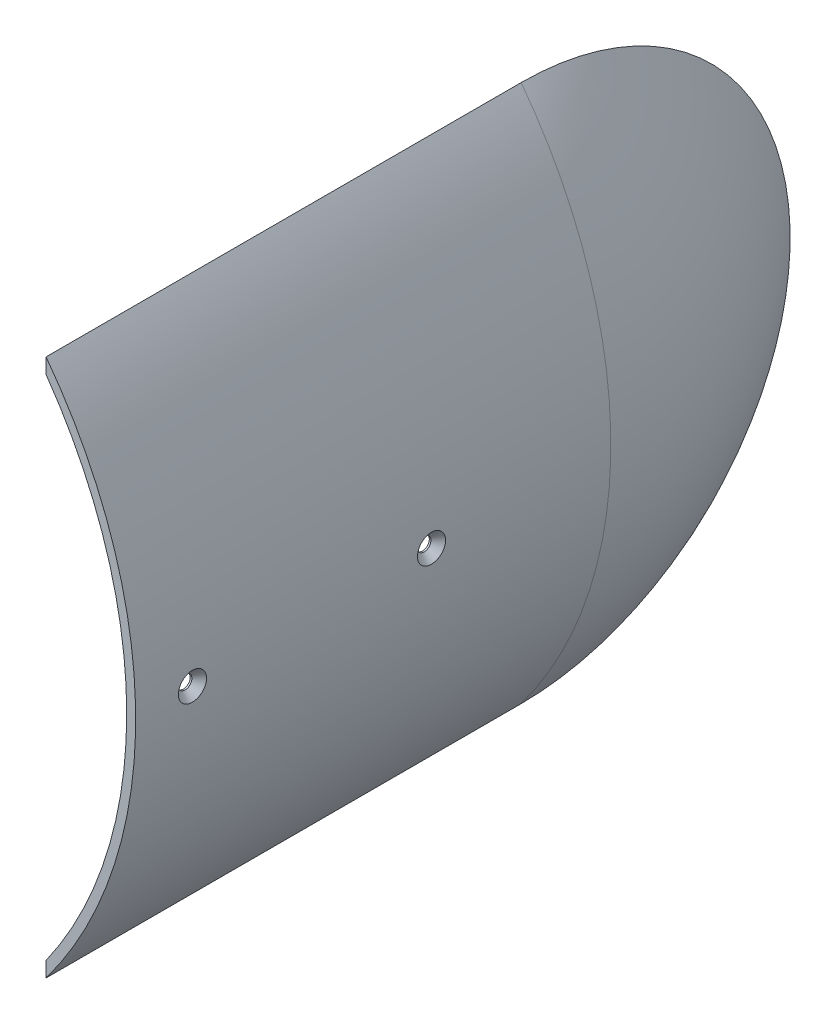
ISO-10303-21;
HEADER;
FILE_DESCRIPTION(('STEP AP214'),'2;1');
FILE_NAME('part.step','',(''),(''),'','','');
FILE_SCHEMA(('AUTOMOTIVE_DESIGN { 1 0 10303 214 1 1 1 1 }'));
ENDSEC;
DATA;
#1=APPLICATION_CONTEXT('core data for automotive mechanical design processes');
#2=APPLICATION_PROTOCOL_DEFINITION('international standard','automotive_design',2000,#1);
#3=PRODUCT_CONTEXT('',#1,'mechanical');
#4=PRODUCT('Part','Part','',(#3));
#5=PRODUCT_RELATED_PRODUCT_CATEGORY('part','',(#4));
#6=PRODUCT_DEFINITION_FORMATION('','',#4);
#7=PRODUCT_DEFINITION_CONTEXT('part definition',#1,'design');
#8=PRODUCT_DEFINITION('design','',#6,#7);
#9=PRODUCT_DEFINITION_SHAPE('','',#8);
#10=(LENGTH_UNIT() NAMED_UNIT(*) SI_UNIT(.MILLI.,.METRE.));
#11=(NAMED_UNIT(*) PLANE_ANGLE_UNIT() SI_UNIT($,.RADIAN.));
#12=(NAMED_UNIT(*) SI_UNIT($,.STERADIAN.) SOLID_ANGLE_UNIT());
#13=UNCERTAINTY_MEASURE_WITH_UNIT(LENGTH_MEASURE(1.E-05),#10,'distance_accuracy_value','');
#14=(GEOMETRIC_REPRESENTATION_CONTEXT(3) GLOBAL_UNCERTAINTY_ASSIGNED_CONTEXT((#13)) GLOBAL_UNIT_ASSIGNED_CONTEXT((#10,
#11,#12)) REPRESENTATION_CONTEXT('',''));
#15=CARTESIAN_POINT('',(0.,0.,0.));
#16=DIRECTION('',(0.,0.,1.));
#17=DIRECTION('',(1.,0.,0.));
#18=AXIS2_PLACEMENT_3D('',#15,#16,#17);
#19=CARTESIAN_POINT('',(0.,0.,0.));
#20=DIRECTION('',(0.,0.,1.));
#21=DIRECTION('',(0.707106781186546,-0.707106781186549,0.));
#22=AXIS2_PLACEMENT_3D('',#19,#20,#21);
#23=SPHERICAL_SURFACE('',#22,150.);
#24=CARTESIAN_POINT('',(0.,0.,0.));
#25=DIRECTION('',(0.,0.,1.));
#26=DIRECTION('',(1.,0.,0.));
#27=AXIS2_PLACEMENT_3D('',#24,#25,#26);
#28=CIRCLE('',#27,150.);
#29=CARTESIAN_POINT('',(120.,-90.,0.));
#30=VERTEX_POINT('',#29);
#31=CARTESIAN_POINT('',(120.,90.,0.));
#32=VERTEX_POINT('',#31);
#33=EDGE_CURVE('E95',#30,#32,#28,.T.);
#34=ORIENTED_EDGE('',*,*,#33,.F.);
#35=CARTESIAN_POINT('',(120.,0.,0.));
#36=DIRECTION('',(-1.,0.,0.));
#37=DIRECTION('',(0.,0.,1.));
#38=AXIS2_PLACEMENT_3D('',#35,#36,#37);
#39=CIRCLE('',#38,89.9999999999997);
#40=EDGE_CURVE('E88',#32,#30,#39,.T.);
#41=ORIENTED_EDGE('',*,*,#40,.F.);
#42=EDGE_LOOP('',(#34,#41));
#43=FACE_BOUND('',#42,.T.);
#44=ADVANCED_FACE('F35',(#43),#23,.T.);
#45=CARTESIAN_POINT('',(0.,0.,0.));
#46=DIRECTION('',(0.,0.,1.));
#47=DIRECTION('',(0.707106781186546,-0.707106781186549,0.));
#48=AXIS2_PLACEMENT_3D('',#45,#46,#47);
#49=SPHERICAL_SURFACE('',#48,147.);
#50=CARTESIAN_POINT('',(0.,0.,0.));
#51=DIRECTION('',(0.,0.,-1.));
#52=DIRECTION('',(1.,0.,0.));
#53=AXIS2_PLACEMENT_3D('',#50,#51,#52);
#54=CIRCLE('',#53,147.);
#55=CARTESIAN_POINT('',(120.,84.9058301885094,0.));
#56=VERTEX_POINT('',#55);
#57=CARTESIAN_POINT('',(120.,-84.9058301885094,0.));
#58=VERTEX_POINT('',#57);
#59=EDGE_CURVE('E91',#56,#58,#54,.T.);
#60=ORIENTED_EDGE('',*,*,#59,.F.);
#61=CARTESIAN_POINT('',(120.,0.,0.));
#62=DIRECTION('',(-1.,0.,0.));
#63=DIRECTION('',(0.,0.,1.));
#64=AXIS2_PLACEMENT_3D('',#61,#62,#63);
#65=CIRCLE('',#64,84.9058301885091);
#66=EDGE_CURVE('E78',#58,#56,#65,.F.);
#67=ORIENTED_EDGE('',*,*,#66,.F.);
#68=EDGE_LOOP('',(#60,#67));
#69=FACE_BOUND('',#68,.T.);
#70=ADVANCED_FACE('F92',(#69),#49,.F.);
#71=CARTESIAN_POINT('',(0.,0.,159.));
#72=DIRECTION('',(0.,0.,-1.));
#73=DIRECTION('',(-1.,0.,0.));
#74=AXIS2_PLACEMENT_3D('',#71,#72,#73);
#75=CYLINDRICAL_SURFACE('',#74,150.);
#76=CARTESIAN_POINT('',(149.963711516846,-3.29927693076681,136.703793568535));
#77=CARTESIAN_POINT('',(149.960177438163,-3.45991808115799,136.869590821439));
#78=CARTESIAN_POINT('',(149.956655071522,-3.60827631750234,137.047369029014));
#79=CARTESIAN_POINT('',(149.949939356816,-3.877351146255,137.4228858195));
#80=CARTESIAN_POINT('',(149.946746278919,-3.99804513897104,137.620640533132));
#81=CARTESIAN_POINT('',(149.940554616057,-4.22430307955091,138.061025128286));
#82=CARTESIAN_POINT('',(149.937648395354,-4.32526869296003,138.306036039697));
#83=CARTESIAN_POINT('',(149.932951101816,-4.48515452730595,138.80944359398));
#84=CARTESIAN_POINT('',(149.931160328584,-4.54406345269391,139.067843812969));
#85=CARTESIAN_POINT('',(149.928879040552,-4.61873035421112,139.593669563639));
#86=CARTESIAN_POINT('',(149.928402750995,-4.63401630568057,139.861162360825));
#87=CARTESIAN_POINT('',(149.928844870639,-4.61968829566137,140.394932697987));
#88=CARTESIAN_POINT('',(149.929763262133,-4.59007490422189,140.661210253349));
#89=CARTESIAN_POINT('',(149.932898361615,-4.48649734256548,141.186149427737));
#90=CARTESIAN_POINT('',(149.935120445897,-4.41234948663331,141.444774823469));
#91=CARTESIAN_POINT('',(149.940615184469,-4.22148976560155,141.945813805521));
#92=CARTESIAN_POINT('',(149.943887837765,-4.10477794080732,142.188227407191));
#93=CARTESIAN_POINT('',(149.951090809016,-3.83258835076391,142.648594497941));
#94=CARTESIAN_POINT('',(149.955017789638,-3.67730543530427,142.866663179351));
#95=CARTESIAN_POINT('',(149.963089300736,-3.3319056046011,143.273213069164));
#96=CARTESIAN_POINT('',(149.967233817459,-3.14179088937551,143.461696144834));
#97=CARTESIAN_POINT('',(149.975207210311,-2.73460927291729,143.801163921327));
#98=CARTESIAN_POINT('',(149.979039373112,-2.51790729878557,143.952586162308));
#99=CARTESIAN_POINT('',(149.986001801176,-2.06183869393164,144.216252362287));
#100=CARTESIAN_POINT('',(149.989132128973,-1.82247408513677,144.328499812223));
#101=CARTESIAN_POINT('',(149.994285616131,-1.33174421104542,144.508889560413));
#102=CARTESIAN_POINT('',(149.996324712351,-1.08061345008694,144.577669533399));
#103=CARTESIAN_POINT('',(149.999132629382,-0.570317904118171,144.671603104254));
#104=CARTESIAN_POINT('',(149.999901540948,-0.311153694452898,144.696759819049));
#105=CARTESIAN_POINT('',(150.000079660846,0.204917307846344,144.702621428006));
#106=CARTESIAN_POINT('',(149.999503198008,0.461818903695111,144.68379476239));
#107=CARTESIAN_POINT('',(149.99708569365,0.968794032111193,144.603251561756));
#108=CARTESIAN_POINT('',(149.995244675656,1.21886769161321,144.541535824631));
#109=CARTESIAN_POINT('',(149.990507214639,1.70494194013315,144.377190307556));
#110=CARTESIAN_POINT('',(149.987611611774,1.94095355830558,144.274593090624));
#111=CARTESIAN_POINT('',(149.981087058968,2.39261515696912,144.031591170132));
#112=CARTESIAN_POINT('',(149.977458081188,2.60826436402132,143.891185031229));
#113=CARTESIAN_POINT('',(149.969830068977,3.01528756294487,143.575237478157));
#114=CARTESIAN_POINT('',(149.965827911192,3.20641754593795,143.399381912095));
#115=CARTESIAN_POINT('',(149.957923582015,3.55696106979604,143.018487797472));
#116=CARTESIAN_POINT('',(149.954021417859,3.71637232046546,142.813447143485));
#117=CARTESIAN_POINT('',(149.946687907184,4.00143518718085,142.376799025538));
#118=CARTESIAN_POINT('',(149.943264275763,4.12655931656105,142.14484706274));
#119=CARTESIAN_POINT('',(149.937334311566,4.33669011735863,141.663422775416));
#120=CARTESIAN_POINT('',(149.934828047256,4.42169379453287,141.413949144819));
#121=CARTESIAN_POINT('',(149.930981484684,4.55027787719948,140.900994183296));
#122=CARTESIAN_POINT('',(149.929657164974,4.59329132918213,140.637370512808));
#123=CARTESIAN_POINT('',(149.928379736923,4.63480194208962,140.106633421594));
#124=CARTESIAN_POINT('',(149.92842669674,4.63329689029003,139.839519828066));
#125=CARTESIAN_POINT('',(149.929891796762,4.58564177830561,139.307465308326));
#126=CARTESIAN_POINT('',(149.931319264771,4.53918800796954,139.042551532788));
#127=CARTESIAN_POINT('',(149.935397996528,4.40239345257302,138.524308564669));
#128=CARTESIAN_POINT('',(149.938049265825,4.31205246848905,138.270979424627));
#129=CARTESIAN_POINT('',(149.944267315921,4.09010212945715,137.783744975357));
#130=CARTESIAN_POINT('',(149.947832138364,3.95858091916824,137.549799516179));
#131=CARTESIAN_POINT('',(149.955471736463,3.657738732962,137.107622646792));
#132=CARTESIAN_POINT('',(149.959546488807,3.48841948472222,136.89939006197));
#133=CARTESIAN_POINT('',(149.96768999543,3.1186086309176,136.516953838442));
#134=CARTESIAN_POINT('',(149.971758365606,2.91846205894055,136.342416659504));
#135=CARTESIAN_POINT('',(149.979461400611,2.49132174594433,136.0300312887));
#136=CARTESIAN_POINT('',(149.983096101685,2.26433025177052,135.89218002946));
#137=CARTESIAN_POINT('',(149.989458338531,1.79357522922562,135.659258248985));
#138=CARTESIAN_POINT('',(149.992198602759,1.55011254771572,135.563579997045));
#139=CARTESIAN_POINT('',(149.996529589908,1.05045611605368,135.415042075834));
#140=CARTESIAN_POINT('',(149.998120435194,0.794263724196964,135.362177848556));
#141=CARTESIAN_POINT('',(149.999956407376,0.279934455083996,135.301336867916));
#142=CARTESIAN_POINT('',(150.000218495631,0.0218644210149906,135.292794322599));
#143=CARTESIAN_POINT('',(149.999413036307,-0.492056616866934,135.31934158416));
#144=CARTESIAN_POINT('',(149.998345333245,-0.747907357672488,135.354436493234));
#145=CARTESIAN_POINT('',(149.995008199455,-1.24904948969632,135.466933177066));
#146=CARTESIAN_POINT('',(149.992743446554,-1.49437799279328,135.544170306216));
#147=CARTESIAN_POINT('',(149.987269203814,-1.96857022455994,135.738454683283));
#148=CARTESIAN_POINT('',(149.984060395261,-2.1974456790359,135.855473231971));
#149=CARTESIAN_POINT('',(149.97796175815,-2.57626675491984,136.090741746998));
#150=CARTESIAN_POINT('',(149.975203582933,-2.73133087701698,136.200868238295));
#151=CARTESIAN_POINT('',(149.969531441158,-3.02678785649367,136.439230856734));
#152=CARTESIAN_POINT('',(149.966617519485,-3.16718490659124,136.567461783774));
#153=CARTESIAN_POINT('',(149.963711516846,-3.29927693076681,136.703793568535));
#154=B_SPLINE_CURVE_WITH_KNOTS('',3,(#76,#77,#78,#79,#80,#81,#82,#83,#84,#85,#86,#87,#88,#89,
#90,#91,#92,#93,#94,#95,#96,#97,#98,#99,#100,#101,#102,#103,#104,#105,#106,#107,#108,#109,#110,
#111,#112,#113,#114,#115,#116,#117,#118,#119,#120,#121,#122,#123,#124,#125,#126,#127,#128,#129,
#130,#131,#132,#133,#134,#135,#136,#137,#138,#139,#140,#141,#142,#143,#144,#145,#146,#147,#148,
#149,#150,#151,#152,#153),.UNSPECIFIED.,.T.,.F.,(4,2,2,2,2,2,2,2,2,2,2,2,2,2,2,2,2,2,2,2,2,2,2,
2,2,2,2,2,2,2,2,2,2,2,2,2,2,2,4),(0.,0.692112176585254,1.38478775960135,2.17605013552575,
2.96752494814662,3.76753206797697,4.56752903087514,5.37084852055953,6.17416724955362,
6.9735075657107,7.7727974119755,8.56213851807299,9.35140926654721,10.1288147351755,
10.9061646551057,11.6752732935588,12.4443676241551,13.212850574459,13.9813627028263,
14.7570110675012,15.5327154162032,16.3197574844227,17.1068582813628,17.9044453143297,
18.7020719902125,19.5051259895012,20.3081836305827,21.1095339755052,21.9108476997012,
22.7037694055214,23.4966247929041,24.2776481396271,25.0585883272083,25.8295343896975,
26.6005706015013,27.3686157969523,28.136108078663,28.7053813411136,29.274491423674),.UNSPECIFIED.);
#155=CARTESIAN_POINT('',(149.963711516846,-3.29927693076681,136.703793568535));
#156=VERTEX_POINT('',#155);
#157=EDGE_CURVE('E11',#156,#156,#154,.T.);
#158=ORIENTED_EDGE('',*,*,#157,.T.);
#159=EDGE_LOOP('',(#158));
#160=FACE_BOUND('',#159,.T.);
#161=CARTESIAN_POINT('',(149.963711516846,-3.29927693076683,56.7037935685348));
#162=CARTESIAN_POINT('',(149.960177438163,-3.45991808115801,56.8695908214393));
#163=CARTESIAN_POINT('',(149.956655071522,-3.60827631750236,57.0473690290139));
#164=CARTESIAN_POINT('',(149.949939356816,-3.87735114625501,57.4228858194998));
#165=CARTESIAN_POINT('',(149.946746278919,-3.99804513897103,57.6206405331323));
#166=CARTESIAN_POINT('',(149.940554616057,-4.2243030795509,58.0610251282861));
#167=CARTESIAN_POINT('',(149.937648395354,-4.32526869296003,58.3060360396969));
#168=CARTESIAN_POINT('',(149.932951101816,-4.48515452730596,58.8094435939802));
#169=CARTESIAN_POINT('',(149.931160328584,-4.54406345269392,59.0678438129694));
#170=CARTESIAN_POINT('',(149.928879040552,-4.61873035421112,59.5936695636391));
#171=CARTESIAN_POINT('',(149.928402750995,-4.63401630568057,59.8611623608253));
#172=CARTESIAN_POINT('',(149.928844870639,-4.61968829566136,60.3949326979873));
#173=CARTESIAN_POINT('',(149.929763262133,-4.59007490422188,60.661210253349));
#174=CARTESIAN_POINT('',(149.932898361615,-4.48649734256547,61.186149427737));
#175=CARTESIAN_POINT('',(149.935120445897,-4.41234948663329,61.4447748234693));
#176=CARTESIAN_POINT('',(149.940615184469,-4.22148976560153,61.9458138055209));
#177=CARTESIAN_POINT('',(149.943887837765,-4.10477794080731,62.1882274071913));
#178=CARTESIAN_POINT('',(149.951090809016,-3.83258835076389,62.6485944979411));
#179=CARTESIAN_POINT('',(149.955017789638,-3.67730543530425,62.8666631793513));
#180=CARTESIAN_POINT('',(149.963089300736,-3.33190560460108,63.2732130691644));
#181=CARTESIAN_POINT('',(149.967233817459,-3.1417908893755,63.4616961448342));
#182=CARTESIAN_POINT('',(149.975207210311,-2.73460927291728,63.8011639213267));
#183=CARTESIAN_POINT('',(149.979039373112,-2.51790729878556,63.9525861623078));
#184=CARTESIAN_POINT('',(149.986001801176,-2.06183869393162,64.2162523622869));
#185=CARTESIAN_POINT('',(149.989132128973,-1.82247408513675,64.3284998122233));
#186=CARTESIAN_POINT('',(149.994285616131,-1.33174421104541,64.5088895604126));
#187=CARTESIAN_POINT('',(149.996324712351,-1.08061345008693,64.5776695333987));
#188=CARTESIAN_POINT('',(149.999132629382,-0.570317904118162,64.671603104254));
#189=CARTESIAN_POINT('',(149.999901540948,-0.311153694452892,64.6967598190492));
#190=CARTESIAN_POINT('',(150.000079660846,0.204917307846351,64.7026214280056));
#191=CARTESIAN_POINT('',(149.999503198008,0.461818903695121,64.6837947623901));
#192=CARTESIAN_POINT('',(149.99708569365,0.968794032111205,64.6032515617561));
#193=CARTESIAN_POINT('',(149.995244675656,1.21886769161322,64.5415358246314));
#194=CARTESIAN_POINT('',(149.990507214639,1.70494194013317,64.3771903075558));
#195=CARTESIAN_POINT('',(149.987611611774,1.9409535583056,64.2745930906244));
#196=CARTESIAN_POINT('',(149.981087058968,2.39261515696914,64.031591170132));
#197=CARTESIAN_POINT('',(149.977458081188,2.60826436402133,63.8911850312294));
#198=CARTESIAN_POINT('',(149.969830068977,3.01528756294489,63.5752374781567));
#199=CARTESIAN_POINT('',(149.965827911192,3.20641754593797,63.3993819120951));
#200=CARTESIAN_POINT('',(149.957923582015,3.55696106979606,63.0184877974723));
#201=CARTESIAN_POINT('',(149.954021417859,3.71637232046547,62.8134471434852));
#202=CARTESIAN_POINT('',(149.946687907184,4.00143518718086,62.3767990255382));
#203=CARTESIAN_POINT('',(149.943264275763,4.12655931656106,62.1448470627404));
#204=CARTESIAN_POINT('',(149.937334311566,4.33669011735863,61.6634227754155));
#205=CARTESIAN_POINT('',(149.934828047256,4.42169379453287,61.4139491448185));
#206=CARTESIAN_POINT('',(149.930981484684,4.55027787719949,60.9009941832958));
#207=CARTESIAN_POINT('',(149.929657164974,4.59329132918213,60.6373705128082));
#208=CARTESIAN_POINT('',(149.928379736923,4.63480194208962,60.106633421594));
#209=CARTESIAN_POINT('',(149.92842669674,4.63329689029003,59.8395198280657));
#210=CARTESIAN_POINT('',(149.929891796762,4.58564177830561,59.3074653083263));
#211=CARTESIAN_POINT('',(149.931319264771,4.53918800796954,59.0425515327883));
#212=CARTESIAN_POINT('',(149.935397996528,4.40239345257302,58.5243085646685));
#213=CARTESIAN_POINT('',(149.938049265825,4.31205246848905,58.2709794246274));
#214=CARTESIAN_POINT('',(149.944267315921,4.09010212945716,57.7837449753568));
#215=CARTESIAN_POINT('',(149.947832138364,3.95858091916824,57.5497995161794));
#216=CARTESIAN_POINT('',(149.955471736463,3.65773873296201,57.1076226467918));
#217=CARTESIAN_POINT('',(149.959546488807,3.48841948472222,56.8993900619696));
#218=CARTESIAN_POINT('',(149.96768999543,3.11860863091759,56.5169538384423));
#219=CARTESIAN_POINT('',(149.971758365606,2.91846205894054,56.3424166595038));
#220=CARTESIAN_POINT('',(149.979461400611,2.49132174594431,56.0300312887));
#221=CARTESIAN_POINT('',(149.983096101685,2.26433025177049,55.8921800294599));
#222=CARTESIAN_POINT('',(149.989458338531,1.79357522922559,55.659258248985));
#223=CARTESIAN_POINT('',(149.992198602759,1.5501125477157,55.5635799970454));
#224=CARTESIAN_POINT('',(149.996529589908,1.05045611605367,55.4150420758341));
#225=CARTESIAN_POINT('',(149.998120435194,0.794263724196956,55.3621778485559));
#226=CARTESIAN_POINT('',(149.999956407376,0.279934455083991,55.3013368679156));
#227=CARTESIAN_POINT('',(150.000218495631,0.0218644210149852,55.2927943225986));
#228=CARTESIAN_POINT('',(149.999413036307,-0.492056616866944,55.3193415841604));
#229=CARTESIAN_POINT('',(149.998345333245,-0.747907357672502,55.3544364932337));
#230=CARTESIAN_POINT('',(149.995008199455,-1.24904948969632,55.4669331770657));
#231=CARTESIAN_POINT('',(149.992743446554,-1.49437799279328,55.5441703062159));
#232=CARTESIAN_POINT('',(149.987269203814,-1.96857022455994,55.738454683283));
#233=CARTESIAN_POINT('',(149.984060395261,-2.19744567903591,55.8554732319706));
#234=CARTESIAN_POINT('',(149.97796175815,-2.57626675491986,56.0907417469981));
#235=CARTESIAN_POINT('',(149.975203582933,-2.73133087701699,56.2008682382952));
#236=CARTESIAN_POINT('',(149.969531441158,-3.02678785649368,56.4392308567344));
#237=CARTESIAN_POINT('',(149.966617519485,-3.16718490659125,56.5674617837736));
#238=CARTESIAN_POINT('',(149.963711516846,-3.29927693076683,56.7037935685348));
#239=B_SPLINE_CURVE_WITH_KNOTS('',3,(#161,#162,#163,#164,#165,#166,#167,#168,#169,#170,#171,
#172,#173,#174,#175,#176,#177,#178,#179,#180,#181,#182,#183,#184,#185,#186,#187,#188,#189,#190,
#191,#192,#193,#194,#195,#196,#197,#198,#199,#200,#201,#202,#203,#204,#205,#206,#207,#208,#209,
#210,#211,#212,#213,#214,#215,#216,#217,#218,#219,#220,#221,#222,#223,#224,#225,#226,#227,#228,
#229,#230,#231,#232,#233,#234,#235,#236,#237,#238),.UNSPECIFIED.,.T.,.F.,(4,2,2,2,2,2,2,2,2,2,2,
2,2,2,2,2,2,2,2,2,2,2,2,2,2,2,2,2,2,2,2,2,2,2,2,2,2,2,4),(0.,0.692112176585285,1.38478775960135,
2.17605013552575,2.96752494814661,3.76753206797697,4.56752903087516,5.37084852055959,
6.17416724955361,6.97350756571073,7.77279741197548,8.56213851807298,9.35140926654721,
10.1288147351755,10.9061646551057,11.6752732935588,12.444367624155,13.212850574459,
13.9813627028263,14.7570110675012,15.5327154162032,16.3197574844227,17.1068582813627,
17.9044453143297,18.7020719902125,19.5051259895013,20.3081836305827,21.1095339755052,
21.9108476997012,22.7037694055214,23.4966247929041,24.2776481396271,25.0585883272083,
25.8295343896975,26.6005706015013,27.3686157969523,28.136108078663,28.7053813411136,
29.274491423674),.UNSPECIFIED.);
#240=CARTESIAN_POINT('',(149.963711516846,-3.29927693076683,56.7037935685348));
#241=VERTEX_POINT('',#240);
#242=EDGE_CURVE('E49',#241,#241,#239,.T.);
#243=ORIENTED_EDGE('',*,*,#242,.T.);
#244=EDGE_LOOP('',(#243));
#245=FACE_BOUND('',#244,.T.);
#246=ORIENTED_EDGE('',*,*,#33,.T.);
#247=DIRECTION('',(0.,0.,-1.));
#248=VECTOR('',#247,1.);
#249=CARTESIAN_POINT('',(120.,90.,159.));
#250=LINE('',#249,#248);
#251=CARTESIAN_POINT('',(120.,90.,159.));
#252=VERTEX_POINT('',#251);
#253=EDGE_CURVE('E99',#252,#32,#250,.T.);
#254=ORIENTED_EDGE('',*,*,#253,.F.);
#255=CARTESIAN_POINT('',(0.,0.,159.));
#256=DIRECTION('',(0.,0.,1.));
#257=DIRECTION('',(1.,0.,0.));
#258=AXIS2_PLACEMENT_3D('',#255,#256,#257);
#259=CIRCLE('',#258,150.);
#260=CARTESIAN_POINT('',(120.,-90.,159.));
#261=VERTEX_POINT('',#260);
#262=EDGE_CURVE('E94',#261,#252,#259,.T.);
#263=ORIENTED_EDGE('',*,*,#262,.F.);
#264=DIRECTION('',(0.,0.,-1.));
#265=VECTOR('',#264,1.);
#266=CARTESIAN_POINT('',(120.,-90.,159.));
#267=LINE('',#266,#265);
#268=EDGE_CURVE('E103',#261,#30,#267,.T.);
#269=ORIENTED_EDGE('',*,*,#268,.T.);
#270=EDGE_LOOP('',(#246,#254,#263,#269));
#271=FACE_BOUND('',#270,.T.);
#272=ADVANCED_FACE('F37',(#160,#245,#271),#75,.T.);
#273=CARTESIAN_POINT('',(0.,0.,159.));
#274=DIRECTION('',(0.,0.,-1.));
#275=DIRECTION('',(-1.,0.,0.));
#276=AXIS2_PLACEMENT_3D('',#273,#274,#275);
#277=CYLINDRICAL_SURFACE('',#276,147.);
#278=CARTESIAN_POINT('',(147.,0.,137.75));
#279=CARTESIAN_POINT('',(146.999999767354,0.126375546336478,137.750005601714));
#280=CARTESIAN_POINT('',(146.999835283425,0.252842538450478,137.760682915088));
#281=CARTESIAN_POINT('',(146.999194936766,0.502293011050223,137.803128364135));
#282=CARTESIAN_POINT('',(146.998718699995,0.625272121618184,137.834921835643));
#283=CARTESIAN_POINT('',(146.99750879289,0.864096856697377,137.918693813278));
#284=CARTESIAN_POINT('',(146.996775246309,0.979945878971692,137.97066261743));
#285=CARTESIAN_POINT('',(146.995133515181,1.2012425051153,138.093296575769));
#286=CARTESIAN_POINT('',(146.994225373868,1.30669267422046,138.16395710308));
#287=CARTESIAN_POINT('',(146.992336519766,1.50425484706294,138.321989107806));
#288=CARTESIAN_POINT('',(146.991355794104,1.59636447588824,138.409363554261));
#289=CARTESIAN_POINT('',(146.989432422928,1.76461147082046,138.598339554438));
#290=CARTESIAN_POINT('',(146.988489778917,1.84074820738624,138.699941668653));
#291=CARTESIAN_POINT('',(146.986748863578,1.97488608970135,138.914490283503));
#292=CARTESIAN_POINT('',(146.985950596644,2.03288668333953,139.027437129362));
#293=CARTESIAN_POINT('',(146.984588490318,2.12910189655437,139.261466420746));
#294=CARTESIAN_POINT('',(146.984024650333,2.16731656620582,139.382548845681));
#295=CARTESIAN_POINT('',(146.983195019518,2.22287244756071,139.629402358206));
#296=CARTESIAN_POINT('',(146.982929205584,2.24021527739016,139.75517308155));
#297=CARTESIAN_POINT('',(146.98272552697,2.25354013272604,140.007841024247));
#298=CARTESIAN_POINT('',(146.982787661513,2.24952220889604,140.134738240928));
#299=CARTESIAN_POINT('',(146.983232851443,2.22024107086215,140.386045997538));
#300=CARTESIAN_POINT('',(146.983615880035,2.19497963046587,140.510456744196));
#301=CARTESIAN_POINT('',(146.984659633968,2.12393126762693,140.753271333492));
#302=CARTESIAN_POINT('',(146.985320359684,2.07814431738515,140.871675167993));
#303=CARTESIAN_POINT('',(146.986845049273,1.96734264559995,141.099120415609));
#304=CARTESIAN_POINT('',(146.987709021738,1.90232711104284,141.208161432598));
#305=CARTESIAN_POINT('',(146.989542791927,1.75491448625564,141.413781339277));
#306=CARTESIAN_POINT('',(146.990512589681,1.67251739088644,141.510360225282));
#307=CARTESIAN_POINT('',(146.992448796423,1.49267054236976,141.688324715023));
#308=CARTESIAN_POINT('',(146.993415205052,1.39521924405076,141.769708757255));
#309=CARTESIAN_POINT('',(146.99523558526,1.18803577624891,141.914961309399));
#310=CARTESIAN_POINT('',(146.996089556824,1.07830360507403,141.978829816897));
#311=CARTESIAN_POINT('',(146.997588790356,0.849672508553723,142.087238075463));
#312=CARTESIAN_POINT('',(146.998234051826,0.730773561282259,142.131777780296));
#313=CARTESIAN_POINT('',(146.999243111226,0.48718446863825,142.200263105632));
#314=CARTESIAN_POINT('',(146.999606909364,0.362494327561225,142.22420874141));
#315=CARTESIAN_POINT('',(147.000012002912,0.110875969129586,142.250824282197));
#316=CARTESIAN_POINT('',(147.000053331046,-0.016052019813434,142.253496346092));
#317=CARTESIAN_POINT('',(146.999808911958,-0.268554892827875,142.237494513983));
#318=CARTESIAN_POINT('',(146.999523164824,-0.39412977726195,142.218820623701));
#319=CARTESIAN_POINT('',(146.998656829004,-0.640355754904068,142.160658761315));
#320=CARTESIAN_POINT('',(146.998076254163,-0.761007079016152,142.121171766511));
#321=CARTESIAN_POINT('',(146.996685709649,-0.993968090371464,142.022505604477));
#322=CARTESIAN_POINT('',(146.995875739878,-1.10627777404344,141.963326428816));
#323=CARTESIAN_POINT('',(146.99411762266,-1.31937733291162,141.826950250031));
#324=CARTESIAN_POINT('',(146.993169464067,-1.42016627776241,141.749751793307));
#325=CARTESIAN_POINT('',(146.991241893372,-1.60735396686146,141.579530587086));
#326=CARTESIAN_POINT('',(146.990262481239,-1.69375269724934,141.486507822347));
#327=CARTESIAN_POINT('',(146.988382729563,-1.8497145347671,141.287269381347));
#328=CARTESIAN_POINT('',(146.987482396576,-1.91927624660837,141.181052612798));
#329=CARTESIAN_POINT('',(146.985862413186,-2.0395798229459,140.958447006401));
#330=CARTESIAN_POINT('',(146.985142762536,-2.09032171319308,140.842058182472));
#331=CARTESIAN_POINT('',(146.983965325916,-2.17154286454912,140.602417612071));
#332=CARTESIAN_POINT('',(146.98350752817,-2.20202303686456,140.479166174494));
#333=CARTESIAN_POINT('',(146.982905377454,-2.24185853501688,140.229294533727));
#334=CARTESIAN_POINT('',(146.98276102483,-2.25121383751249,140.102674326815));
#335=CARTESIAN_POINT('',(146.98280204456,-2.24853385502184,139.849673771852));
#336=CARTESIAN_POINT('',(146.98298738262,-2.23650079489415,139.723293400221));
#337=CARTESIAN_POINT('',(146.983666817301,-2.19139018442243,139.474346658552));
#338=CARTESIAN_POINT('',(146.984160914541,-2.1583125918957,139.351780296159));
#339=CARTESIAN_POINT('',(146.985402167584,-2.0720516127226,139.113938537857));
#340=CARTESIAN_POINT('',(146.986149328031,-2.01886785702097,138.998663275825));
#341=CARTESIAN_POINT('',(146.987812436142,-1.89390669625394,138.778681713768));
#342=CARTESIAN_POINT('',(146.988728377314,-1.82213000623577,138.673975007513));
#343=CARTESIAN_POINT('',(146.990625823505,-1.66202034493844,138.478096564593));
#344=CARTESIAN_POINT('',(146.991607328366,-1.57368741347504,138.386924795378));
#345=CARTESIAN_POINT('',(146.993525518857,-1.38294323497786,138.220681476247));
#346=CARTESIAN_POINT('',(146.994462193299,-1.28052849769488,138.145613929692));
#347=CARTESIAN_POINT('',(146.996185312889,-1.06450431394408,138.013706296591));
#348=CARTESIAN_POINT('',(146.996971679407,-0.950889054943608,137.956875739951));
#349=CARTESIAN_POINT('',(146.998303944493,-0.715817568199668,137.863161449577));
#350=CARTESIAN_POINT('',(146.998850130797,-0.59437092360367,137.826253836149));
#351=CARTESIAN_POINT('',(146.999493890634,-0.393460046586398,137.783255281058));
#352=CARTESIAN_POINT('',(146.999682862527,-0.315300932251653,137.770800147575));
#353=CARTESIAN_POINT('',(146.999935989987,-0.158106478306908,137.754170754907));
#354=CARTESIAN_POINT('',(147.000000145563,-0.0790711387629302,137.749996495098));
#355=CARTESIAN_POINT('',(147.,0.,137.75));
#356=B_SPLINE_CURVE_WITH_KNOTS('',3,(#278,#279,#280,#281,#282,#283,#284,#285,#286,#287,#288,
#289,#290,#291,#292,#293,#294,#295,#296,#297,#298,#299,#300,#301,#302,#303,#304,#305,#306,#307,
#308,#309,#310,#311,#312,#313,#314,#315,#316,#317,#318,#319,#320,#321,#322,#323,#324,#325,#326,
#327,#328,#329,#330,#331,#332,#333,#334,#335,#336,#337,#338,#339,#340,#341,#342,#343,#344,#345,
#346,#347,#348,#349,#350,#351,#352,#353,#354,#355),.UNSPECIFIED.,.T.,.F.,(4,2,2,2,2,2,2,2,2,2,2,
2,2,2,2,2,2,2,2,2,2,2,2,2,2,2,2,2,2,2,2,2,2,2,2,2,2,2,4),(0.,0.378838026850223,
0.758131418688121,1.13724264025983,1.51626010579022,1.89534496211787,2.27444475654786,
2.65355609063384,3.03266646524916,3.4117474467739,3.79082752919264,4.16987596203145,
4.54892490824334,4.92798988351105,5.30705497085494,5.68615899152725,6.06526306443228,
6.444368044146,6.82347274266947,7.20253896838657,7.58160509250494,7.96065341878597,
8.33970190734545,8.71878098398332,9.097860425741,9.47697127117454,9.85608159787359,
10.2351748741331,10.6142685692597,10.99332283264,11.3723778558181,11.7514398370143,
12.130487242405,12.5095337362439,12.8886743486624,13.2680127630876,13.6468954861734,
13.8839283403544,14.1209611766754),.UNSPECIFIED.);
#357=CARTESIAN_POINT('',(147.,0.,137.75));
#358=VERTEX_POINT('',#357);
#359=EDGE_CURVE('E40',#358,#358,#356,.T.);
#360=ORIENTED_EDGE('',*,*,#359,.T.);
#361=EDGE_LOOP('',(#360));
#362=FACE_BOUND('',#361,.T.);
#363=CARTESIAN_POINT('',(147.,0.,57.75));
#364=CARTESIAN_POINT('',(146.999999767354,0.126375546336478,57.7500056017139));
#365=CARTESIAN_POINT('',(146.999835283425,0.252842538450478,57.7606829150878));
#366=CARTESIAN_POINT('',(146.999194936766,0.502293011050224,57.8031283641349));
#367=CARTESIAN_POINT('',(146.998718699995,0.625272121618186,57.8349218356434));
#368=CARTESIAN_POINT('',(146.99750879289,0.864096856697386,57.9186938132784));
#369=CARTESIAN_POINT('',(146.996775246309,0.979945878971707,57.9706626174305));
#370=CARTESIAN_POINT('',(146.995133515181,1.20124250511532,58.0932965757694));
#371=CARTESIAN_POINT('',(146.994225373868,1.30669267422047,58.1639571030799));
#372=CARTESIAN_POINT('',(146.992336519766,1.50425484706295,58.3219891078064));
#373=CARTESIAN_POINT('',(146.991355794104,1.59636447588825,58.4093635542611));
#374=CARTESIAN_POINT('',(146.989432422928,1.76461147082047,58.5983395544376));
#375=CARTESIAN_POINT('',(146.988489778917,1.84074820738624,58.6999416686527));
#376=CARTESIAN_POINT('',(146.986748863578,1.97488608970135,58.9144902835025));
#377=CARTESIAN_POINT('',(146.985950596644,2.03288668333954,59.0274371293619));
#378=CARTESIAN_POINT('',(146.984588490318,2.12910189655438,59.2614664207462));
#379=CARTESIAN_POINT('',(146.984024650333,2.16731656620582,59.3825488456805));
#380=CARTESIAN_POINT('',(146.983195019518,2.22287244756072,59.6294023582063));
#381=CARTESIAN_POINT('',(146.982929205584,2.24021527739016,59.7551730815498));
#382=CARTESIAN_POINT('',(146.98272552697,2.25354013272604,60.0078410242467));
#383=CARTESIAN_POINT('',(146.982787661513,2.24952220889604,60.1347382409277));
#384=CARTESIAN_POINT('',(146.983232851443,2.22024107086215,60.3860459975376));
#385=CARTESIAN_POINT('',(146.983615880035,2.19497963046586,60.5104567441958));
#386=CARTESIAN_POINT('',(146.984659633968,2.12393126762692,60.7532713334915));
#387=CARTESIAN_POINT('',(146.985320359684,2.07814431738514,60.8716751679931));
#388=CARTESIAN_POINT('',(146.986845049273,1.96734264559994,61.0991204156094));
#389=CARTESIAN_POINT('',(146.987709021738,1.90232711104284,61.2081614325983));
#390=CARTESIAN_POINT('',(146.989542791927,1.75491448625564,61.4137813392771));
#391=CARTESIAN_POINT('',(146.990512589681,1.67251739088643,61.5103602252823));
#392=CARTESIAN_POINT('',(146.992448796423,1.49267054236975,61.6883247150228));
#393=CARTESIAN_POINT('',(146.993415205052,1.39521924405075,61.7697087572551));
#394=CARTESIAN_POINT('',(146.99523558526,1.1880357762489,61.9149613093989));
#395=CARTESIAN_POINT('',(146.996089556824,1.07830360507401,61.9788298168971));
#396=CARTESIAN_POINT('',(146.997588790356,0.849672508553709,62.0872380754628));
#397=CARTESIAN_POINT('',(146.998234051826,0.730773561282245,62.131777780296));
#398=CARTESIAN_POINT('',(146.999243111226,0.487184468638238,62.200263105632));
#399=CARTESIAN_POINT('',(146.999606909364,0.362494327561215,62.2242087414099));
#400=CARTESIAN_POINT('',(147.000012002912,0.110875969129577,62.2508242821972));
#401=CARTESIAN_POINT('',(147.000053331046,-0.0160520198134436,62.2534963460919));
#402=CARTESIAN_POINT('',(146.999808911958,-0.268554892827884,62.237494513983));
#403=CARTESIAN_POINT('',(146.999523164824,-0.394129777261959,62.2188206237006));
#404=CARTESIAN_POINT('',(146.998656829004,-0.640355754904078,62.1606587613145));
#405=CARTESIAN_POINT('',(146.998076254163,-0.761007079016163,62.1211717665107));
#406=CARTESIAN_POINT('',(146.996685709649,-0.993968090371473,62.0225056044766));
#407=CARTESIAN_POINT('',(146.995875739878,-1.10627777404345,61.9633264288158));
#408=CARTESIAN_POINT('',(146.99411762266,-1.31937733291163,61.8269502500306));
#409=CARTESIAN_POINT('',(146.993169464067,-1.42016627776241,61.7497517933068));
#410=CARTESIAN_POINT('',(146.991241893372,-1.60735396686146,61.5795305870858));
#411=CARTESIAN_POINT('',(146.990262481239,-1.69375269724934,61.4865078223469));
#412=CARTESIAN_POINT('',(146.988382729563,-1.84971453476711,61.2872693813471));
#413=CARTESIAN_POINT('',(146.987482396576,-1.91927624660838,61.181052612798));
#414=CARTESIAN_POINT('',(146.985862413186,-2.03957982294591,60.9584470064011));
#415=CARTESIAN_POINT('',(146.985142762536,-2.09032171319308,60.8420581824717));
#416=CARTESIAN_POINT('',(146.983965325916,-2.17154286454912,60.6024176120708));
#417=CARTESIAN_POINT('',(146.98350752817,-2.20202303686455,60.4791661744937));
#418=CARTESIAN_POINT('',(146.982905377454,-2.24185853501688,60.2292945337269));
#419=CARTESIAN_POINT('',(146.98276102483,-2.25121383751249,60.1026743268151));
#420=CARTESIAN_POINT('',(146.98280204456,-2.24853385502184,59.8496737718516));
#421=CARTESIAN_POINT('',(146.98298738262,-2.23650079489414,59.7232934002208));
#422=CARTESIAN_POINT('',(146.983666817301,-2.19139018442242,59.4743466585515));
#423=CARTESIAN_POINT('',(146.984160914541,-2.15831259189569,59.3517802961586));
#424=CARTESIAN_POINT('',(146.985402167584,-2.0720516127226,59.1139385378574));
#425=CARTESIAN_POINT('',(146.986149328031,-2.01886785702097,58.998663275825));
#426=CARTESIAN_POINT('',(146.987812436142,-1.89390669625394,58.778681713768));
#427=CARTESIAN_POINT('',(146.988728377314,-1.82213000623577,58.673975007513));
#428=CARTESIAN_POINT('',(146.990625823505,-1.66202034493844,58.4780965645927));
#429=CARTESIAN_POINT('',(146.991607328366,-1.57368741347505,58.3869247953785));
#430=CARTESIAN_POINT('',(146.993525518857,-1.38294323497787,58.220681476247));
#431=CARTESIAN_POINT('',(146.994462193299,-1.28052849769489,58.145613929692));
#432=CARTESIAN_POINT('',(146.996185312889,-1.06450431394409,58.0137062965906));
#433=CARTESIAN_POINT('',(146.996971679407,-0.95088905494361,57.9568757399512));
#434=CARTESIAN_POINT('',(146.998303944493,-0.71581756819966,57.8631614495766));
#435=CARTESIAN_POINT('',(146.998850130797,-0.594370923603653,57.8262538361488));
#436=CARTESIAN_POINT('',(146.999493890634,-0.393460046586379,57.7832552810581));
#437=CARTESIAN_POINT('',(146.999682862527,-0.315300932251638,57.7708001475753));
#438=CARTESIAN_POINT('',(146.999935989987,-0.158106478306901,57.7541707549072));
#439=CARTESIAN_POINT('',(147.000000145563,-0.0790711387629263,57.7499964950981));
#440=CARTESIAN_POINT('',(147.,0.,57.75));
#441=B_SPLINE_CURVE_WITH_KNOTS('',3,(#363,#364,#365,#366,#367,#368,#369,#370,#371,#372,#373,
#374,#375,#376,#377,#378,#379,#380,#381,#382,#383,#384,#385,#386,#387,#388,#389,#390,#391,#392,
#393,#394,#395,#396,#397,#398,#399,#400,#401,#402,#403,#404,#405,#406,#407,#408,#409,#410,#411,
#412,#413,#414,#415,#416,#417,#418,#419,#420,#421,#422,#423,#424,#425,#426,#427,#428,#429,#430,
#431,#432,#433,#434,#435,#436,#437,#438,#439,#440),.UNSPECIFIED.,.T.,.F.,(4,2,2,2,2,2,2,2,2,2,2,
2,2,2,2,2,2,2,2,2,2,2,2,2,2,2,2,2,2,2,2,2,2,2,2,2,2,2,4),(0.,0.378838026850221,
0.758131418688127,1.13724264025985,1.51626010579022,1.89534496211788,2.27444475654788,
2.65355609063387,3.03266646524917,3.4117474467739,3.79082752919266,4.16987596203147,
4.54892490824336,4.92798988351106,5.30705497085494,5.68615899152725,6.06526306443231,
6.44436804414602,6.82347274266948,7.20253896838658,7.58160509250495,7.96065341878598,
8.33970190734546,8.71878098398332,9.09786042574101,9.47697127117455,9.85608159787358,
10.235174874133,10.6142685692597,10.99332283264,11.3723778558181,11.7514398370143,
12.130487242405,12.5095337362439,12.8886743486624,13.2680127630876,13.6468954861734,
13.8839283403544,14.1209611766754),.UNSPECIFIED.);
#442=CARTESIAN_POINT('',(147.,0.,57.75));
#443=VERTEX_POINT('',#442);
#444=EDGE_CURVE('E89',#443,#443,#441,.T.);
#445=ORIENTED_EDGE('',*,*,#444,.T.);
#446=EDGE_LOOP('',(#445));
#447=FACE_BOUND('',#446,.T.);
#448=ORIENTED_EDGE('',*,*,#59,.T.);
#449=DIRECTION('',(0.,0.,-1.));
#450=VECTOR('',#449,1.);
#451=CARTESIAN_POINT('',(120.,-84.9058301885094,159.));
#452=LINE('',#451,#450);
#453=CARTESIAN_POINT('',(120.,-84.9058301885094,159.));
#454=VERTEX_POINT('',#453);
#455=EDGE_CURVE('E85',#454,#58,#452,.T.);
#456=ORIENTED_EDGE('',*,*,#455,.F.);
#457=CARTESIAN_POINT('',(0.,0.,159.));
#458=DIRECTION('',(0.,0.,-1.));
#459=DIRECTION('',(1.,0.,0.));
#460=AXIS2_PLACEMENT_3D('',#457,#458,#459);
#461=CIRCLE('',#460,147.);
#462=CARTESIAN_POINT('',(120.,84.9058301885094,159.));
#463=VERTEX_POINT('',#462);
#464=EDGE_CURVE('E98',#463,#454,#461,.T.);
#465=ORIENTED_EDGE('',*,*,#464,.F.);
#466=DIRECTION('',(0.,0.,-1.));
#467=VECTOR('',#466,1.);
#468=CARTESIAN_POINT('',(120.,84.9058301885094,159.));
#469=LINE('',#468,#467);
#470=EDGE_CURVE('E82',#463,#56,#469,.T.);
#471=ORIENTED_EDGE('',*,*,#470,.T.);
#472=EDGE_LOOP('',(#448,#456,#465,#471));
#473=FACE_BOUND('',#472,.T.);
#474=ADVANCED_FACE('F97',(#362,#447,#473),#277,.F.);
#475=CARTESIAN_POINT('',(120.,-84.9058301885094,159.));
#476=DIRECTION('',(1.,0.,0.));
#477=DIRECTION('',(0.,1.,0.));
#478=AXIS2_PLACEMENT_3D('',#475,#476,#477);
#479=PLANE('',#478);
#480=ORIENTED_EDGE('',*,*,#455,.T.);
#481=ORIENTED_EDGE('',*,*,#66,.T.);
#482=ORIENTED_EDGE('',*,*,#470,.F.);
#483=DIRECTION('',(0.,-1.,0.));
#484=VECTOR('',#483,1.);
#485=CARTESIAN_POINT('',(120.,90.,159.));
#486=LINE('',#485,#484);
#487=EDGE_CURVE('E159',#252,#463,#486,.T.);
#488=ORIENTED_EDGE('',*,*,#487,.F.);
#489=ORIENTED_EDGE('',*,*,#253,.T.);
#490=ORIENTED_EDGE('',*,*,#40,.T.);
#491=ORIENTED_EDGE('',*,*,#268,.F.);
#492=DIRECTION('',(0.,-1.,0.));
#493=VECTOR('',#492,1.);
#494=CARTESIAN_POINT('',(120.,-84.9058301885094,159.));
#495=LINE('',#494,#493);
#496=EDGE_CURVE('E56',#454,#261,#495,.T.);
#497=ORIENTED_EDGE('',*,*,#496,.F.);
#498=EDGE_LOOP('',(#480,#481,#482,#488,#489,#490,#491,#497));
#499=FACE_BOUND('',#498,.T.);
#500=ADVANCED_FACE('F80',(#499),#479,.F.);
#501=CARTESIAN_POINT('',(0.,0.,159.));
#502=DIRECTION('',(0.,0.,1.));
#503=DIRECTION('',(1.,0.,0.));
#504=AXIS2_PLACEMENT_3D('',#501,#502,#503);
#505=PLANE('',#504);
#506=ORIENTED_EDGE('',*,*,#262,.T.);
#507=ORIENTED_EDGE('',*,*,#487,.T.);
#508=ORIENTED_EDGE('',*,*,#464,.T.);
#509=ORIENTED_EDGE('',*,*,#496,.T.);
#510=EDGE_LOOP('',(#506,#507,#508,#509));
#511=FACE_BOUND('',#510,.T.);
#512=ADVANCED_FACE('F126',(#511),#505,.T.);
#513=CARTESIAN_POINT('',(150.,0.,60.));
#514=DIRECTION('',(1.,0.,0.));
#515=DIRECTION('',(0.,0.,-1.));
#516=AXIS2_PLACEMENT_3D('',#513,#514,#515);
#517=CYLINDRICAL_SURFACE('',#516,2.25);
#518=CARTESIAN_POINT('',(147.55,0.,60.));
#519=DIRECTION('',(1.,0.,0.));
#520=DIRECTION('',(0.,0.,-1.));
#521=AXIS2_PLACEMENT_3D('',#518,#519,#520);
#522=CIRCLE('',#521,2.25);
#523=CARTESIAN_POINT('',(147.55,0.,57.75));
#524=VERTEX_POINT('',#523);
#525=EDGE_CURVE('E150',#524,#524,#522,.T.);
#526=ORIENTED_EDGE('',*,*,#525,.T.);
#527=EDGE_LOOP('',(#526));
#528=FACE_BOUND('',#527,.T.);
#529=ORIENTED_EDGE('',*,*,#444,.F.);
#530=EDGE_LOOP('',(#529));
#531=FACE_BOUND('',#530,.T.);
#532=ADVANCED_FACE('F119',(#528,#531),#517,.F.);
#533=CARTESIAN_POINT('',(150.,0.,60.));
#534=DIRECTION('',(1.,0.,0.));
#535=DIRECTION('',(0.,0.,-1.));
#536=AXIS2_PLACEMENT_3D('',#533,#534,#535);
#537=CONICAL_SURFACE('',#536,4.7,0.785398163397447);
#538=ORIENTED_EDGE('',*,*,#525,.F.);
#539=EDGE_LOOP('',(#538));
#540=FACE_BOUND('',#539,.T.);
#541=ORIENTED_EDGE('',*,*,#242,.F.);
#542=EDGE_LOOP('',(#541));
#543=FACE_BOUND('',#542,.T.);
#544=ADVANCED_FACE('F115',(#540,#543),#537,.F.);
#545=CARTESIAN_POINT('',(150.,0.,140.));
#546=DIRECTION('',(1.,0.,0.));
#547=DIRECTION('',(0.,0.,-1.));
#548=AXIS2_PLACEMENT_3D('',#545,#546,#547);
#549=CYLINDRICAL_SURFACE('',#548,2.25);
#550=CARTESIAN_POINT('',(147.55,0.,140.));
#551=DIRECTION('',(1.,0.,0.));
#552=DIRECTION('',(0.,0.,-1.));
#553=AXIS2_PLACEMENT_3D('',#550,#551,#552);
#554=CIRCLE('',#553,2.25);
#555=CARTESIAN_POINT('',(147.55,0.,137.75));
#556=VERTEX_POINT('',#555);
#557=EDGE_CURVE('E154',#556,#556,#554,.T.);
#558=ORIENTED_EDGE('',*,*,#557,.T.);
#559=EDGE_LOOP('',(#558));
#560=FACE_BOUND('',#559,.T.);
#561=ORIENTED_EDGE('',*,*,#359,.F.);
#562=EDGE_LOOP('',(#561));
#563=FACE_BOUND('',#562,.T.);
#564=ADVANCED_FACE('F118',(#560,#563),#549,.F.);
#565=CARTESIAN_POINT('',(150.,0.,140.));
#566=DIRECTION('',(1.,0.,0.));
#567=DIRECTION('',(0.,0.,-1.));
#568=AXIS2_PLACEMENT_3D('',#565,#566,#567);
#569=CONICAL_SURFACE('',#568,4.7,0.785398163397447);
#570=ORIENTED_EDGE('',*,*,#557,.F.);
#571=EDGE_LOOP('',(#570));
#572=FACE_BOUND('',#571,.T.);
#573=ORIENTED_EDGE('',*,*,#157,.F.);
#574=EDGE_LOOP('',(#573));
#575=FACE_BOUND('',#574,.T.);
#576=ADVANCED_FACE('F174',(#572,#575),#569,.F.);
#577=CLOSED_SHELL('',(#44,#70,#272,#474,#500,#512,#532,#544,#564,#576));
#578=MANIFOLD_SOLID_BREP('B2',#577);
#579=ADVANCED_BREP_SHAPE_REPRESENTATION('',(#18,#578),#14);
#580=SHAPE_DEFINITION_REPRESENTATION(#9,#579);
ENDSEC;
END-ISO-10303-21;
